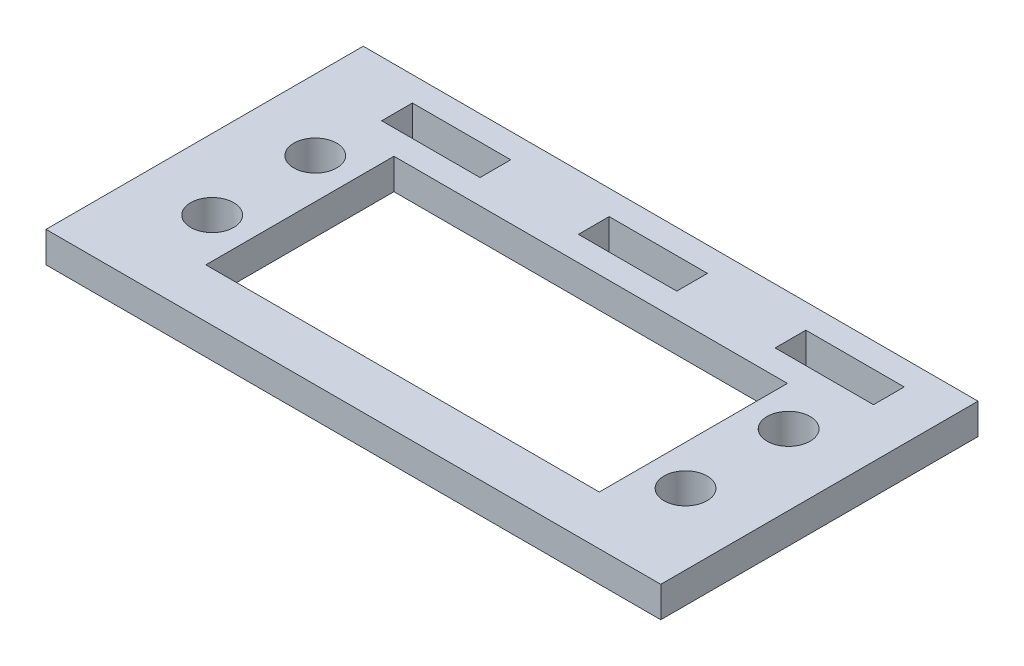
ISO-10303-21;
HEADER;
FILE_DESCRIPTION(('STEP AP214'),'2;1');
FILE_NAME('part.step','',(''),(''),'','','');
FILE_SCHEMA(('AUTOMOTIVE_DESIGN { 1 0 10303 214 1 1 1 1 }'));
ENDSEC;
DATA;
#1=APPLICATION_CONTEXT('core data for automotive mechanical design processes');
#2=APPLICATION_PROTOCOL_DEFINITION('international standard','automotive_design',2000,#1);
#3=PRODUCT_CONTEXT('',#1,'mechanical');
#4=PRODUCT('Part','Part','',(#3));
#5=PRODUCT_RELATED_PRODUCT_CATEGORY('part','',(#4));
#6=PRODUCT_DEFINITION_FORMATION('','',#4);
#7=PRODUCT_DEFINITION_CONTEXT('part definition',#1,'design');
#8=PRODUCT_DEFINITION('design','',#6,#7);
#9=PRODUCT_DEFINITION_SHAPE('','',#8);
#10=(LENGTH_UNIT() NAMED_UNIT(*) SI_UNIT(.MILLI.,.METRE.));
#11=(NAMED_UNIT(*) PLANE_ANGLE_UNIT() SI_UNIT($,.RADIAN.));
#12=(NAMED_UNIT(*) SI_UNIT($,.STERADIAN.) SOLID_ANGLE_UNIT());
#13=UNCERTAINTY_MEASURE_WITH_UNIT(LENGTH_MEASURE(1.E-05),#10,'distance_accuracy_value','');
#14=(GEOMETRIC_REPRESENTATION_CONTEXT(3) GLOBAL_UNCERTAINTY_ASSIGNED_CONTEXT((#13)) GLOBAL_UNIT_ASSIGNED_CONTEXT((#10,
#11,#12)) REPRESENTATION_CONTEXT('',''));
#15=CARTESIAN_POINT('',(0.,0.,0.));
#16=DIRECTION('',(0.,0.,1.));
#17=DIRECTION('',(1.,0.,0.));
#18=AXIS2_PLACEMENT_3D('',#15,#16,#17);
#19=CARTESIAN_POINT('',(31.75,3.175,14.7955));
#20=DIRECTION('',(0.,-1.,0.));
#21=DIRECTION('',(0.,0.,-1.));
#22=AXIS2_PLACEMENT_3D('',#19,#20,#21);
#23=PLANE('',#22);
#24=CARTESIAN_POINT('',(24.4475,3.175,-5.71191009209215));
#25=DIRECTION('',(0.,1.,0.));
#26=DIRECTION('',(0.,0.,1.));
#27=AXIS2_PLACEMENT_3D('',#24,#25,#26);
#28=CIRCLE('',#27,2.2225);
#29=CARTESIAN_POINT('',(24.4475,3.175,-3.48941009209216));
#30=VERTEX_POINT('',#29);
#31=EDGE_CURVE('E472',#30,#30,#28,.T.);
#32=ORIENTED_EDGE('',*,*,#31,.F.);
#33=EDGE_LOOP('',(#32));
#34=FACE_BOUND('',#33,.T.);
#35=CARTESIAN_POINT('',(-24.4475,3.175,-5.71191009209215));
#36=DIRECTION('',(0.,1.,0.));
#37=DIRECTION('',(0.,0.,1.));
#38=AXIS2_PLACEMENT_3D('',#35,#36,#37);
#39=CIRCLE('',#38,2.2225);
#40=CARTESIAN_POINT('',(-24.4475,3.175,-3.48941009209216));
#41=VERTEX_POINT('',#40);
#42=EDGE_CURVE('E200',#41,#41,#39,.T.);
#43=ORIENTED_EDGE('',*,*,#42,.F.);
#44=EDGE_LOOP('',(#43));
#45=FACE_BOUND('',#44,.T.);
#46=DIRECTION('',(0.,0.,1.));
#47=VECTOR('',#46,1.);
#48=CARTESIAN_POINT('',(-24.13,3.175,-15.4304999999997));
#49=LINE('',#48,#47);
#50=CARTESIAN_POINT('',(-24.13,3.175,-15.4304999999997));
#51=VERTEX_POINT('',#50);
#52=CARTESIAN_POINT('',(-24.13,3.175,-12.2554999999997));
#53=VERTEX_POINT('',#52);
#54=EDGE_CURVE('E210',#51,#53,#49,.T.);
#55=ORIENTED_EDGE('',*,*,#54,.F.);
#56=DIRECTION('',(-1.,0.,0.));
#57=VECTOR('',#56,1.);
#58=CARTESIAN_POINT('',(-13.97,3.175,-15.4304999999997));
#59=LINE('',#58,#57);
#60=CARTESIAN_POINT('',(-13.97,3.175,-15.4304999999997));
#61=VERTEX_POINT('',#60);
#62=EDGE_CURVE('E218',#61,#51,#59,.T.);
#63=ORIENTED_EDGE('',*,*,#62,.F.);
#64=DIRECTION('',(0.,0.,-1.));
#65=VECTOR('',#64,1.);
#66=CARTESIAN_POINT('',(-13.97,3.175,-15.4304999999997));
#67=LINE('',#66,#65);
#68=CARTESIAN_POINT('',(-13.97,3.175,-12.2554999999997));
#69=VERTEX_POINT('',#68);
#70=EDGE_CURVE('E215',#69,#61,#67,.T.);
#71=ORIENTED_EDGE('',*,*,#70,.F.);
#72=DIRECTION('',(1.,0.,0.));
#73=VECTOR('',#72,1.);
#74=CARTESIAN_POINT('',(-13.97,3.175,-12.2554999999997));
#75=LINE('',#74,#73);
#76=EDGE_CURVE('E212',#53,#69,#75,.T.);
#77=ORIENTED_EDGE('',*,*,#76,.F.);
#78=EDGE_LOOP('',(#55,#63,#71,#77));
#79=FACE_BOUND('',#78,.T.);
#80=DIRECTION('',(0.,0.,1.));
#81=VECTOR('',#80,1.);
#82=CARTESIAN_POINT('',(16.51,3.175,-15.4305));
#83=LINE('',#82,#81);
#84=CARTESIAN_POINT('',(16.51,3.175,-15.4305));
#85=VERTEX_POINT('',#84);
#86=CARTESIAN_POINT('',(16.51,3.175,-12.2555));
#87=VERTEX_POINT('',#86);
#88=EDGE_CURVE('E272',#85,#87,#83,.T.);
#89=ORIENTED_EDGE('',*,*,#88,.F.);
#90=DIRECTION('',(-1.,0.,0.));
#91=VECTOR('',#90,1.);
#92=CARTESIAN_POINT('',(26.67,3.175,-15.4305));
#93=LINE('',#92,#91);
#94=CARTESIAN_POINT('',(26.67,3.175,-15.4305));
#95=VERTEX_POINT('',#94);
#96=EDGE_CURVE('E280',#95,#85,#93,.T.);
#97=ORIENTED_EDGE('',*,*,#96,.F.);
#98=DIRECTION('',(0.,0.,-1.));
#99=VECTOR('',#98,1.);
#100=CARTESIAN_POINT('',(26.67,3.175,-15.4305));
#101=LINE('',#100,#99);
#102=CARTESIAN_POINT('',(26.67,3.175,-12.2555));
#103=VERTEX_POINT('',#102);
#104=EDGE_CURVE('E277',#103,#95,#101,.T.);
#105=ORIENTED_EDGE('',*,*,#104,.F.);
#106=DIRECTION('',(1.,0.,0.));
#107=VECTOR('',#106,1.);
#108=CARTESIAN_POINT('',(26.67,3.175,-12.2555));
#109=LINE('',#108,#107);
#110=EDGE_CURVE('E274',#87,#103,#109,.T.);
#111=ORIENTED_EDGE('',*,*,#110,.F.);
#112=EDGE_LOOP('',(#89,#97,#105,#111));
#113=FACE_BOUND('',#112,.T.);
#114=DIRECTION('',(0.,0.,-1.));
#115=VECTOR('',#114,1.);
#116=CARTESIAN_POINT('',(31.75,3.175,-17.9705));
#117=LINE('',#116,#115);
#118=CARTESIAN_POINT('',(31.75,3.175,14.7955));
#119=VERTEX_POINT('',#118);
#120=CARTESIAN_POINT('',(31.75,3.175,-17.9705));
#121=VERTEX_POINT('',#120);
#122=EDGE_CURVE('E303',#119,#121,#117,.T.);
#123=ORIENTED_EDGE('',*,*,#122,.T.);
#124=DIRECTION('',(-1.,0.,0.));
#125=VECTOR('',#124,1.);
#126=CARTESIAN_POINT('',(31.75,3.175,-17.9705));
#127=LINE('',#126,#125);
#128=CARTESIAN_POINT('',(-31.75,3.175,-17.9705));
#129=VERTEX_POINT('',#128);
#130=EDGE_CURVE('E306',#121,#129,#127,.T.);
#131=ORIENTED_EDGE('',*,*,#130,.T.);
#132=DIRECTION('',(0.,0.,1.));
#133=VECTOR('',#132,1.);
#134=CARTESIAN_POINT('',(-31.75,3.175,-17.9705));
#135=LINE('',#134,#133);
#136=CARTESIAN_POINT('',(-31.75,3.175,14.7955));
#137=VERTEX_POINT('',#136);
#138=EDGE_CURVE('E309',#129,#137,#135,.T.);
#139=ORIENTED_EDGE('',*,*,#138,.T.);
#140=DIRECTION('',(1.,0.,0.));
#141=VECTOR('',#140,1.);
#142=CARTESIAN_POINT('',(31.75,3.175,14.7955));
#143=LINE('',#142,#141);
#144=EDGE_CURVE('E311',#137,#119,#143,.T.);
#145=ORIENTED_EDGE('',*,*,#144,.T.);
#146=EDGE_LOOP('',(#123,#131,#139,#145));
#147=FACE_BOUND('',#146,.T.);
#148=DIRECTION('',(0.,0.,1.));
#149=VECTOR('',#148,1.);
#150=CARTESIAN_POINT('',(-3.81000000000001,3.175,-15.4304999999999));
#151=LINE('',#150,#149);
#152=CARTESIAN_POINT('',(-3.81000000000001,3.175,-15.4304999999999));
#153=VERTEX_POINT('',#152);
#154=CARTESIAN_POINT('',(-3.81000000000001,3.175,-12.2554999999999));
#155=VERTEX_POINT('',#154);
#156=EDGE_CURVE('E241',#153,#155,#151,.T.);
#157=ORIENTED_EDGE('',*,*,#156,.F.);
#158=DIRECTION('',(-1.,0.,0.));
#159=VECTOR('',#158,1.);
#160=CARTESIAN_POINT('',(6.34999999999999,3.175,-15.4304999999999));
#161=LINE('',#160,#159);
#162=CARTESIAN_POINT('',(6.34999999999999,3.175,-15.4304999999999));
#163=VERTEX_POINT('',#162);
#164=EDGE_CURVE('E249',#163,#153,#161,.T.);
#165=ORIENTED_EDGE('',*,*,#164,.F.);
#166=DIRECTION('',(0.,0.,-1.));
#167=VECTOR('',#166,1.);
#168=CARTESIAN_POINT('',(6.34999999999999,3.175,-15.4304999999999));
#169=LINE('',#168,#167);
#170=CARTESIAN_POINT('',(6.34999999999999,3.175,-12.2554999999999));
#171=VERTEX_POINT('',#170);
#172=EDGE_CURVE('E246',#171,#163,#169,.T.);
#173=ORIENTED_EDGE('',*,*,#172,.F.);
#174=DIRECTION('',(1.,0.,0.));
#175=VECTOR('',#174,1.);
#176=CARTESIAN_POINT('',(6.34999999999999,3.175,-12.2554999999999));
#177=LINE('',#176,#175);
#178=EDGE_CURVE('E243',#155,#171,#177,.T.);
#179=ORIENTED_EDGE('',*,*,#178,.F.);
#180=EDGE_LOOP('',(#157,#165,#173,#179));
#181=FACE_BOUND('',#180,.T.);
#182=DIRECTION('',(0.,0.,-1.));
#183=VECTOR('',#182,1.);
#184=CARTESIAN_POINT('',(20.32,3.175,9.7155));
#185=LINE('',#184,#183);
#186=CARTESIAN_POINT('',(20.32,3.175,9.7155));
#187=VERTEX_POINT('',#186);
#188=CARTESIAN_POINT('',(20.32,3.175,-9.7155));
#189=VERTEX_POINT('',#188);
#190=EDGE_CURVE('E171',#187,#189,#185,.T.);
#191=ORIENTED_EDGE('',*,*,#190,.F.);
#192=DIRECTION('',(1.,0.,0.));
#193=VECTOR('',#192,1.);
#194=CARTESIAN_POINT('',(-20.32,3.175,9.7155));
#195=LINE('',#194,#193);
#196=CARTESIAN_POINT('',(-20.32,3.175,9.7155));
#197=VERTEX_POINT('',#196);
#198=EDGE_CURVE('E194',#197,#187,#195,.T.);
#199=ORIENTED_EDGE('',*,*,#198,.F.);
#200=DIRECTION('',(0.,0.,1.));
#201=VECTOR('',#200,1.);
#202=CARTESIAN_POINT('',(-20.32,3.175,9.7155));
#203=LINE('',#202,#201);
#204=CARTESIAN_POINT('',(-20.32,3.175,-9.7155));
#205=VERTEX_POINT('',#204);
#206=EDGE_CURVE('E192',#205,#197,#203,.T.);
#207=ORIENTED_EDGE('',*,*,#206,.F.);
#208=DIRECTION('',(-1.,0.,0.));
#209=VECTOR('',#208,1.);
#210=CARTESIAN_POINT('',(-20.32,3.175,-9.7155));
#211=LINE('',#210,#209);
#212=EDGE_CURVE('E179',#189,#205,#211,.T.);
#213=ORIENTED_EDGE('',*,*,#212,.F.);
#214=EDGE_LOOP('',(#191,#199,#207,#213));
#215=FACE_BOUND('',#214,.T.);
#216=CARTESIAN_POINT('',(-24.4475,3.175,4.93498923036739));
#217=DIRECTION('',(0.,1.,0.));
#218=DIRECTION('',(0.,0.,1.));
#219=AXIS2_PLACEMENT_3D('',#216,#217,#218);
#220=CIRCLE('',#219,2.2225);
#221=CARTESIAN_POINT('',(-24.4475,3.175,7.15748923036739));
#222=VERTEX_POINT('',#221);
#223=EDGE_CURVE('E478',#222,#222,#220,.T.);
#224=ORIENTED_EDGE('',*,*,#223,.F.);
#225=EDGE_LOOP('',(#224));
#226=FACE_BOUND('',#225,.T.);
#227=CARTESIAN_POINT('',(24.4475,3.175,4.93498923036739));
#228=DIRECTION('',(0.,1.,0.));
#229=DIRECTION('',(0.,0.,1.));
#230=AXIS2_PLACEMENT_3D('',#227,#228,#229);
#231=CIRCLE('',#230,2.2225);
#232=CARTESIAN_POINT('',(24.4475,3.175,7.15748923036739));
#233=VERTEX_POINT('',#232);
#234=EDGE_CURVE('E463',#233,#233,#231,.T.);
#235=ORIENTED_EDGE('',*,*,#234,.F.);
#236=EDGE_LOOP('',(#235));
#237=FACE_BOUND('',#236,.T.);
#238=ADVANCED_FACE('F34',(#34,#45,#79,#113,#147,#181,#215,#226,#237),#23,.F.);
#239=CARTESIAN_POINT('',(31.75,0.,14.7955));
#240=DIRECTION('',(0.,-1.,0.));
#241=DIRECTION('',(0.,0.,-1.));
#242=AXIS2_PLACEMENT_3D('',#239,#240,#241);
#243=PLANE('',#242);
#244=CARTESIAN_POINT('',(24.4475,0.,-5.71191009209215));
#245=DIRECTION('',(0.,1.,0.));
#246=DIRECTION('',(0.,0.,1.));
#247=AXIS2_PLACEMENT_3D('',#244,#245,#246);
#248=CIRCLE('',#247,2.2225);
#249=CARTESIAN_POINT('',(24.4475,0.,-3.48941009209216));
#250=VERTEX_POINT('',#249);
#251=EDGE_CURVE('E469',#250,#250,#248,.T.);
#252=ORIENTED_EDGE('',*,*,#251,.T.);
#253=EDGE_LOOP('',(#252));
#254=FACE_BOUND('',#253,.T.);
#255=CARTESIAN_POINT('',(-24.4475,0.,-5.71191009209215));
#256=DIRECTION('',(0.,1.,0.));
#257=DIRECTION('',(0.,0.,1.));
#258=AXIS2_PLACEMENT_3D('',#255,#256,#257);
#259=CIRCLE('',#258,2.2225);
#260=CARTESIAN_POINT('',(-24.4475,0.,-3.48941009209216));
#261=VERTEX_POINT('',#260);
#262=EDGE_CURVE('E481',#261,#261,#259,.T.);
#263=ORIENTED_EDGE('',*,*,#262,.T.);
#264=EDGE_LOOP('',(#263));
#265=FACE_BOUND('',#264,.T.);
#266=DIRECTION('',(-1.,0.,0.));
#267=VECTOR('',#266,1.);
#268=CARTESIAN_POINT('',(-13.97,0.,-15.4304999999997));
#269=LINE('',#268,#267);
#270=CARTESIAN_POINT('',(-13.97,0.,-15.4304999999997));
#271=VERTEX_POINT('',#270);
#272=CARTESIAN_POINT('',(-24.13,0.,-15.4304999999997));
#273=VERTEX_POINT('',#272);
#274=EDGE_CURVE('E213',#271,#273,#269,.T.);
#275=ORIENTED_EDGE('',*,*,#274,.T.);
#276=DIRECTION('',(0.,0.,1.));
#277=VECTOR('',#276,1.);
#278=CARTESIAN_POINT('',(-24.13,0.,-15.4304999999997));
#279=LINE('',#278,#277);
#280=CARTESIAN_POINT('',(-24.13,0.,-12.2554999999997));
#281=VERTEX_POINT('',#280);
#282=EDGE_CURVE('E187',#273,#281,#279,.T.);
#283=ORIENTED_EDGE('',*,*,#282,.T.);
#284=DIRECTION('',(1.,0.,0.));
#285=VECTOR('',#284,1.);
#286=CARTESIAN_POINT('',(-13.97,0.,-12.2554999999997));
#287=LINE('',#286,#285);
#288=CARTESIAN_POINT('',(-13.97,0.,-12.2554999999997));
#289=VERTEX_POINT('',#288);
#290=EDGE_CURVE('E223',#281,#289,#287,.T.);
#291=ORIENTED_EDGE('',*,*,#290,.T.);
#292=DIRECTION('',(0.,0.,-1.));
#293=VECTOR('',#292,1.);
#294=CARTESIAN_POINT('',(-13.97,0.,-15.4304999999997));
#295=LINE('',#294,#293);
#296=EDGE_CURVE('E226',#289,#271,#295,.T.);
#297=ORIENTED_EDGE('',*,*,#296,.T.);
#298=EDGE_LOOP('',(#275,#283,#291,#297));
#299=FACE_BOUND('',#298,.T.);
#300=DIRECTION('',(-1.,0.,0.));
#301=VECTOR('',#300,1.);
#302=CARTESIAN_POINT('',(26.67,0.,-15.4305));
#303=LINE('',#302,#301);
#304=CARTESIAN_POINT('',(26.67,0.,-15.4305));
#305=VERTEX_POINT('',#304);
#306=CARTESIAN_POINT('',(16.51,0.,-15.4305));
#307=VERTEX_POINT('',#306);
#308=EDGE_CURVE('E275',#305,#307,#303,.T.);
#309=ORIENTED_EDGE('',*,*,#308,.T.);
#310=DIRECTION('',(0.,0.,1.));
#311=VECTOR('',#310,1.);
#312=CARTESIAN_POINT('',(16.51,0.,-15.4305));
#313=LINE('',#312,#311);
#314=CARTESIAN_POINT('',(16.51,0.,-12.2555));
#315=VERTEX_POINT('',#314);
#316=EDGE_CURVE('E271',#307,#315,#313,.T.);
#317=ORIENTED_EDGE('',*,*,#316,.T.);
#318=DIRECTION('',(1.,0.,0.));
#319=VECTOR('',#318,1.);
#320=CARTESIAN_POINT('',(26.67,0.,-12.2555));
#321=LINE('',#320,#319);
#322=CARTESIAN_POINT('',(26.67,0.,-12.2555));
#323=VERTEX_POINT('',#322);
#324=EDGE_CURVE('E285',#315,#323,#321,.T.);
#325=ORIENTED_EDGE('',*,*,#324,.T.);
#326=DIRECTION('',(0.,0.,-1.));
#327=VECTOR('',#326,1.);
#328=CARTESIAN_POINT('',(26.67,0.,-15.4305));
#329=LINE('',#328,#327);
#330=EDGE_CURVE('E288',#323,#305,#329,.T.);
#331=ORIENTED_EDGE('',*,*,#330,.T.);
#332=EDGE_LOOP('',(#309,#317,#325,#331));
#333=FACE_BOUND('',#332,.T.);
#334=DIRECTION('',(0.,0.,-1.));
#335=VECTOR('',#334,1.);
#336=CARTESIAN_POINT('',(31.75,0.,-17.9705));
#337=LINE('',#336,#335);
#338=CARTESIAN_POINT('',(31.75,0.,14.7955));
#339=VERTEX_POINT('',#338);
#340=CARTESIAN_POINT('',(31.75,0.,-17.9705));
#341=VERTEX_POINT('',#340);
#342=EDGE_CURVE('E302',#339,#341,#337,.T.);
#343=ORIENTED_EDGE('',*,*,#342,.F.);
#344=DIRECTION('',(1.,0.,0.));
#345=VECTOR('',#344,1.);
#346=CARTESIAN_POINT('',(31.75,0.,14.7955));
#347=LINE('',#346,#345);
#348=CARTESIAN_POINT('',(-31.75,0.,14.7955));
#349=VERTEX_POINT('',#348);
#350=EDGE_CURVE('E307',#349,#339,#347,.T.);
#351=ORIENTED_EDGE('',*,*,#350,.F.);
#352=DIRECTION('',(0.,0.,1.));
#353=VECTOR('',#352,1.);
#354=CARTESIAN_POINT('',(-31.75,0.,-17.9705));
#355=LINE('',#354,#353);
#356=CARTESIAN_POINT('',(-31.75,0.,-17.9705));
#357=VERTEX_POINT('',#356);
#358=EDGE_CURVE('E318',#357,#349,#355,.T.);
#359=ORIENTED_EDGE('',*,*,#358,.F.);
#360=DIRECTION('',(-1.,0.,0.));
#361=VECTOR('',#360,1.);
#362=CARTESIAN_POINT('',(31.75,0.,-17.9705));
#363=LINE('',#362,#361);
#364=EDGE_CURVE('E316',#341,#357,#363,.T.);
#365=ORIENTED_EDGE('',*,*,#364,.F.);
#366=EDGE_LOOP('',(#343,#351,#359,#365));
#367=FACE_BOUND('',#366,.T.);
#368=DIRECTION('',(-1.,0.,0.));
#369=VECTOR('',#368,1.);
#370=CARTESIAN_POINT('',(6.34999999999999,0.,-15.4304999999999));
#371=LINE('',#370,#369);
#372=CARTESIAN_POINT('',(6.34999999999999,0.,-15.4304999999999));
#373=VERTEX_POINT('',#372);
#374=CARTESIAN_POINT('',(-3.81000000000001,0.,-15.4304999999999));
#375=VERTEX_POINT('',#374);
#376=EDGE_CURVE('E244',#373,#375,#371,.T.);
#377=ORIENTED_EDGE('',*,*,#376,.T.);
#378=DIRECTION('',(0.,0.,1.));
#379=VECTOR('',#378,1.);
#380=CARTESIAN_POINT('',(-3.81000000000001,0.,-15.4304999999999));
#381=LINE('',#380,#379);
#382=CARTESIAN_POINT('',(-3.81000000000001,0.,-12.2554999999999));
#383=VERTEX_POINT('',#382);
#384=EDGE_CURVE('E240',#375,#383,#381,.T.);
#385=ORIENTED_EDGE('',*,*,#384,.T.);
#386=DIRECTION('',(1.,0.,0.));
#387=VECTOR('',#386,1.);
#388=CARTESIAN_POINT('',(6.34999999999999,0.,-12.2554999999999));
#389=LINE('',#388,#387);
#390=CARTESIAN_POINT('',(6.34999999999999,0.,-12.2554999999999));
#391=VERTEX_POINT('',#390);
#392=EDGE_CURVE('E254',#383,#391,#389,.T.);
#393=ORIENTED_EDGE('',*,*,#392,.T.);
#394=DIRECTION('',(0.,0.,-1.));
#395=VECTOR('',#394,1.);
#396=CARTESIAN_POINT('',(6.34999999999999,0.,-15.4304999999999));
#397=LINE('',#396,#395);
#398=EDGE_CURVE('E257',#391,#373,#397,.T.);
#399=ORIENTED_EDGE('',*,*,#398,.T.);
#400=EDGE_LOOP('',(#377,#385,#393,#399));
#401=FACE_BOUND('',#400,.T.);
#402=DIRECTION('',(1.,0.,0.));
#403=VECTOR('',#402,1.);
#404=CARTESIAN_POINT('',(-20.32,0.,9.7155));
#405=LINE('',#404,#403);
#406=CARTESIAN_POINT('',(-20.32,0.,9.7155));
#407=VERTEX_POINT('',#406);
#408=CARTESIAN_POINT('',(20.32,0.,9.7155));
#409=VERTEX_POINT('',#408);
#410=EDGE_CURVE('E180',#407,#409,#405,.T.);
#411=ORIENTED_EDGE('',*,*,#410,.T.);
#412=DIRECTION('',(0.,0.,-1.));
#413=VECTOR('',#412,1.);
#414=CARTESIAN_POINT('',(20.32,0.,9.7155));
#415=LINE('',#414,#413);
#416=CARTESIAN_POINT('',(20.32,0.,-9.7155));
#417=VERTEX_POINT('',#416);
#418=EDGE_CURVE('E57',#409,#417,#415,.T.);
#419=ORIENTED_EDGE('',*,*,#418,.T.);
#420=DIRECTION('',(-1.,0.,0.));
#421=VECTOR('',#420,1.);
#422=CARTESIAN_POINT('',(-20.32,0.,-9.7155));
#423=LINE('',#422,#421);
#424=CARTESIAN_POINT('',(-20.32,0.,-9.7155));
#425=VERTEX_POINT('',#424);
#426=EDGE_CURVE('E186',#417,#425,#423,.T.);
#427=ORIENTED_EDGE('',*,*,#426,.T.);
#428=DIRECTION('',(0.,0.,1.));
#429=VECTOR('',#428,1.);
#430=CARTESIAN_POINT('',(-20.32,0.,9.7155));
#431=LINE('',#430,#429);
#432=EDGE_CURVE('E202',#425,#407,#431,.T.);
#433=ORIENTED_EDGE('',*,*,#432,.T.);
#434=EDGE_LOOP('',(#411,#419,#427,#433));
#435=FACE_BOUND('',#434,.T.);
#436=CARTESIAN_POINT('',(-24.4475,0.,4.93498923036739));
#437=DIRECTION('',(0.,1.,0.));
#438=DIRECTION('',(0.,0.,1.));
#439=AXIS2_PLACEMENT_3D('',#436,#437,#438);
#440=CIRCLE('',#439,2.2225);
#441=CARTESIAN_POINT('',(-24.4475,0.,7.15748923036739));
#442=VERTEX_POINT('',#441);
#443=EDGE_CURVE('E475',#442,#442,#440,.T.);
#444=ORIENTED_EDGE('',*,*,#443,.T.);
#445=EDGE_LOOP('',(#444));
#446=FACE_BOUND('',#445,.T.);
#447=CARTESIAN_POINT('',(24.4475,0.,4.93498923036739));
#448=DIRECTION('',(0.,1.,0.));
#449=DIRECTION('',(0.,0.,1.));
#450=AXIS2_PLACEMENT_3D('',#447,#448,#449);
#451=CIRCLE('',#450,2.2225);
#452=CARTESIAN_POINT('',(24.4475,0.,7.15748923036739));
#453=VERTEX_POINT('',#452);
#454=EDGE_CURVE('E466',#453,#453,#451,.T.);
#455=ORIENTED_EDGE('',*,*,#454,.T.);
#456=EDGE_LOOP('',(#455));
#457=FACE_BOUND('',#456,.T.);
#458=ADVANCED_FACE('F336',(#254,#265,#299,#333,#367,#401,#435,#446,#457),#243,.T.);
#459=CARTESIAN_POINT('',(31.75,3.175,-17.9705));
#460=DIRECTION('',(-1.,0.,0.));
#461=DIRECTION('',(0.,0.,1.));
#462=AXIS2_PLACEMENT_3D('',#459,#460,#461);
#463=PLANE('',#462);
#464=ORIENTED_EDGE('',*,*,#342,.T.);
#465=DIRECTION('',(0.,-1.,0.));
#466=VECTOR('',#465,1.);
#467=CARTESIAN_POINT('',(31.75,3.175,-17.9705));
#468=LINE('',#467,#466);
#469=EDGE_CURVE('E11',#121,#341,#468,.T.);
#470=ORIENTED_EDGE('',*,*,#469,.F.);
#471=ORIENTED_EDGE('',*,*,#122,.F.);
#472=DIRECTION('',(0.,-1.,0.));
#473=VECTOR('',#472,1.);
#474=CARTESIAN_POINT('',(31.75,3.175,14.7955));
#475=LINE('',#474,#473);
#476=EDGE_CURVE('E313',#119,#339,#475,.T.);
#477=ORIENTED_EDGE('',*,*,#476,.T.);
#478=EDGE_LOOP('',(#464,#470,#471,#477));
#479=FACE_BOUND('',#478,.T.);
#480=ADVANCED_FACE('F36',(#479),#463,.F.);
#481=CARTESIAN_POINT('',(31.75,3.175,-17.9705));
#482=DIRECTION('',(0.,0.,1.));
#483=DIRECTION('',(1.,0.,0.));
#484=AXIS2_PLACEMENT_3D('',#481,#482,#483);
#485=PLANE('',#484);
#486=ORIENTED_EDGE('',*,*,#364,.T.);
#487=DIRECTION('',(0.,-1.,0.));
#488=VECTOR('',#487,1.);
#489=CARTESIAN_POINT('',(-31.75,3.175,-17.9705));
#490=LINE('',#489,#488);
#491=EDGE_CURVE('E42',#129,#357,#490,.T.);
#492=ORIENTED_EDGE('',*,*,#491,.F.);
#493=ORIENTED_EDGE('',*,*,#130,.F.);
#494=ORIENTED_EDGE('',*,*,#469,.T.);
#495=EDGE_LOOP('',(#486,#492,#493,#494));
#496=FACE_BOUND('',#495,.T.);
#497=ADVANCED_FACE('F347',(#496),#485,.F.);
#498=CARTESIAN_POINT('',(-31.75,3.175,-17.9705));
#499=DIRECTION('',(1.,0.,0.));
#500=DIRECTION('',(0.,0.,-1.));
#501=AXIS2_PLACEMENT_3D('',#498,#499,#500);
#502=PLANE('',#501);
#503=ORIENTED_EDGE('',*,*,#358,.T.);
#504=DIRECTION('',(0.,-1.,0.));
#505=VECTOR('',#504,1.);
#506=CARTESIAN_POINT('',(-31.75,3.175,14.7955));
#507=LINE('',#506,#505);
#508=EDGE_CURVE('E323',#137,#349,#507,.T.);
#509=ORIENTED_EDGE('',*,*,#508,.F.);
#510=ORIENTED_EDGE('',*,*,#138,.F.);
#511=ORIENTED_EDGE('',*,*,#491,.T.);
#512=EDGE_LOOP('',(#503,#509,#510,#511));
#513=FACE_BOUND('',#512,.T.);
#514=ADVANCED_FACE('F330',(#513),#502,.F.);
#515=CARTESIAN_POINT('',(31.75,3.175,14.7955));
#516=DIRECTION('',(0.,0.,-1.));
#517=DIRECTION('',(-1.,0.,0.));
#518=AXIS2_PLACEMENT_3D('',#515,#516,#517);
#519=PLANE('',#518);
#520=ORIENTED_EDGE('',*,*,#350,.T.);
#521=ORIENTED_EDGE('',*,*,#476,.F.);
#522=ORIENTED_EDGE('',*,*,#144,.F.);
#523=ORIENTED_EDGE('',*,*,#508,.T.);
#524=EDGE_LOOP('',(#520,#521,#522,#523));
#525=FACE_BOUND('',#524,.T.);
#526=ADVANCED_FACE('F340',(#525),#519,.F.);
#527=CARTESIAN_POINT('',(16.51,3.175,-15.4305));
#528=DIRECTION('',(1.,0.,0.));
#529=DIRECTION('',(0.,0.,-1.));
#530=AXIS2_PLACEMENT_3D('',#527,#528,#529);
#531=PLANE('',#530);
#532=ORIENTED_EDGE('',*,*,#316,.F.);
#533=DIRECTION('',(0.,-1.,0.));
#534=VECTOR('',#533,1.);
#535=CARTESIAN_POINT('',(16.51,3.175,-15.4305));
#536=LINE('',#535,#534);
#537=EDGE_CURVE('E282',#85,#307,#536,.T.);
#538=ORIENTED_EDGE('',*,*,#537,.F.);
#539=ORIENTED_EDGE('',*,*,#88,.T.);
#540=DIRECTION('',(0.,-1.,0.));
#541=VECTOR('',#540,1.);
#542=CARTESIAN_POINT('',(16.51,3.175,-12.2555));
#543=LINE('',#542,#541);
#544=EDGE_CURVE('E299',#87,#315,#543,.T.);
#545=ORIENTED_EDGE('',*,*,#544,.T.);
#546=EDGE_LOOP('',(#532,#538,#539,#545));
#547=FACE_BOUND('',#546,.T.);
#548=ADVANCED_FACE('F365',(#547),#531,.T.);
#549=CARTESIAN_POINT('',(26.67,3.175,-12.2555));
#550=DIRECTION('',(0.,0.,-1.));
#551=DIRECTION('',(-1.,0.,0.));
#552=AXIS2_PLACEMENT_3D('',#549,#550,#551);
#553=PLANE('',#552);
#554=ORIENTED_EDGE('',*,*,#324,.F.);
#555=ORIENTED_EDGE('',*,*,#544,.F.);
#556=ORIENTED_EDGE('',*,*,#110,.T.);
#557=DIRECTION('',(0.,-1.,0.));
#558=VECTOR('',#557,1.);
#559=CARTESIAN_POINT('',(26.67,3.175,-12.2555));
#560=LINE('',#559,#558);
#561=EDGE_CURVE('E297',#103,#323,#560,.T.);
#562=ORIENTED_EDGE('',*,*,#561,.T.);
#563=EDGE_LOOP('',(#554,#555,#556,#562));
#564=FACE_BOUND('',#563,.T.);
#565=ADVANCED_FACE('F372',(#564),#553,.T.);
#566=CARTESIAN_POINT('',(26.67,3.175,-15.4305));
#567=DIRECTION('',(-1.,0.,0.));
#568=DIRECTION('',(0.,0.,1.));
#569=AXIS2_PLACEMENT_3D('',#566,#567,#568);
#570=PLANE('',#569);
#571=ORIENTED_EDGE('',*,*,#330,.F.);
#572=ORIENTED_EDGE('',*,*,#561,.F.);
#573=ORIENTED_EDGE('',*,*,#104,.T.);
#574=DIRECTION('',(0.,-1.,0.));
#575=VECTOR('',#574,1.);
#576=CARTESIAN_POINT('',(26.67,3.175,-15.4305));
#577=LINE('',#576,#575);
#578=EDGE_CURVE('E295',#95,#305,#577,.T.);
#579=ORIENTED_EDGE('',*,*,#578,.T.);
#580=EDGE_LOOP('',(#571,#572,#573,#579));
#581=FACE_BOUND('',#580,.T.);
#582=ADVANCED_FACE('F377',(#581),#570,.T.);
#583=CARTESIAN_POINT('',(26.67,3.175,-15.4305));
#584=DIRECTION('',(0.,0.,1.));
#585=DIRECTION('',(1.,0.,0.));
#586=AXIS2_PLACEMENT_3D('',#583,#584,#585);
#587=PLANE('',#586);
#588=ORIENTED_EDGE('',*,*,#308,.F.);
#589=ORIENTED_EDGE('',*,*,#578,.F.);
#590=ORIENTED_EDGE('',*,*,#96,.T.);
#591=ORIENTED_EDGE('',*,*,#537,.T.);
#592=EDGE_LOOP('',(#588,#589,#590,#591));
#593=FACE_BOUND('',#592,.T.);
#594=ADVANCED_FACE('F385',(#593),#587,.T.);
#595=CARTESIAN_POINT('',(-3.81000000000001,3.175,-15.4304999999999));
#596=DIRECTION('',(1.,0.,0.));
#597=DIRECTION('',(0.,0.,-1.));
#598=AXIS2_PLACEMENT_3D('',#595,#596,#597);
#599=PLANE('',#598);
#600=ORIENTED_EDGE('',*,*,#384,.F.);
#601=DIRECTION('',(0.,-1.,0.));
#602=VECTOR('',#601,1.);
#603=CARTESIAN_POINT('',(-3.81000000000001,3.175,-15.4304999999999));
#604=LINE('',#603,#602);
#605=EDGE_CURVE('E251',#153,#375,#604,.T.);
#606=ORIENTED_EDGE('',*,*,#605,.F.);
#607=ORIENTED_EDGE('',*,*,#156,.T.);
#608=DIRECTION('',(0.,-1.,0.));
#609=VECTOR('',#608,1.);
#610=CARTESIAN_POINT('',(-3.81000000000001,3.175,-12.2554999999999));
#611=LINE('',#610,#609);
#612=EDGE_CURVE('E268',#155,#383,#611,.T.);
#613=ORIENTED_EDGE('',*,*,#612,.T.);
#614=EDGE_LOOP('',(#600,#606,#607,#613));
#615=FACE_BOUND('',#614,.T.);
#616=ADVANCED_FACE('F398',(#615),#599,.T.);
#617=CARTESIAN_POINT('',(6.34999999999999,3.175,-12.2554999999999));
#618=DIRECTION('',(0.,0.,-1.));
#619=DIRECTION('',(-1.,0.,0.));
#620=AXIS2_PLACEMENT_3D('',#617,#618,#619);
#621=PLANE('',#620);
#622=ORIENTED_EDGE('',*,*,#392,.F.);
#623=ORIENTED_EDGE('',*,*,#612,.F.);
#624=ORIENTED_EDGE('',*,*,#178,.T.);
#625=DIRECTION('',(0.,-1.,0.));
#626=VECTOR('',#625,1.);
#627=CARTESIAN_POINT('',(6.34999999999999,3.175,-12.2554999999999));
#628=LINE('',#627,#626);
#629=EDGE_CURVE('E266',#171,#391,#628,.T.);
#630=ORIENTED_EDGE('',*,*,#629,.T.);
#631=EDGE_LOOP('',(#622,#623,#624,#630));
#632=FACE_BOUND('',#631,.T.);
#633=ADVANCED_FACE('F403',(#632),#621,.T.);
#634=CARTESIAN_POINT('',(6.34999999999999,3.175,-15.4304999999999));
#635=DIRECTION('',(-1.,0.,0.));
#636=DIRECTION('',(0.,0.,1.));
#637=AXIS2_PLACEMENT_3D('',#634,#635,#636);
#638=PLANE('',#637);
#639=ORIENTED_EDGE('',*,*,#398,.F.);
#640=ORIENTED_EDGE('',*,*,#629,.F.);
#641=ORIENTED_EDGE('',*,*,#172,.T.);
#642=DIRECTION('',(0.,-1.,0.));
#643=VECTOR('',#642,1.);
#644=CARTESIAN_POINT('',(6.34999999999999,3.175,-15.4304999999999));
#645=LINE('',#644,#643);
#646=EDGE_CURVE('E264',#163,#373,#645,.T.);
#647=ORIENTED_EDGE('',*,*,#646,.T.);
#648=EDGE_LOOP('',(#639,#640,#641,#647));
#649=FACE_BOUND('',#648,.T.);
#650=ADVANCED_FACE('F407',(#649),#638,.T.);
#651=CARTESIAN_POINT('',(6.34999999999999,3.175,-15.4304999999999));
#652=DIRECTION('',(0.,0.,1.));
#653=DIRECTION('',(1.,0.,0.));
#654=AXIS2_PLACEMENT_3D('',#651,#652,#653);
#655=PLANE('',#654);
#656=ORIENTED_EDGE('',*,*,#376,.F.);
#657=ORIENTED_EDGE('',*,*,#646,.F.);
#658=ORIENTED_EDGE('',*,*,#164,.T.);
#659=ORIENTED_EDGE('',*,*,#605,.T.);
#660=EDGE_LOOP('',(#656,#657,#658,#659));
#661=FACE_BOUND('',#660,.T.);
#662=ADVANCED_FACE('F411',(#661),#655,.T.);
#663=CARTESIAN_POINT('',(-24.13,3.175,-15.4304999999997));
#664=DIRECTION('',(1.,0.,0.));
#665=DIRECTION('',(0.,0.,-1.));
#666=AXIS2_PLACEMENT_3D('',#663,#664,#665);
#667=PLANE('',#666);
#668=ORIENTED_EDGE('',*,*,#282,.F.);
#669=DIRECTION('',(0.,-1.,0.));
#670=VECTOR('',#669,1.);
#671=CARTESIAN_POINT('',(-24.13,3.175,-15.4304999999997));
#672=LINE('',#671,#670);
#673=EDGE_CURVE('E220',#51,#273,#672,.T.);
#674=ORIENTED_EDGE('',*,*,#673,.F.);
#675=ORIENTED_EDGE('',*,*,#54,.T.);
#676=DIRECTION('',(0.,-1.,0.));
#677=VECTOR('',#676,1.);
#678=CARTESIAN_POINT('',(-24.13,3.175,-12.2554999999997));
#679=LINE('',#678,#677);
#680=EDGE_CURVE('E237',#53,#281,#679,.T.);
#681=ORIENTED_EDGE('',*,*,#680,.T.);
#682=EDGE_LOOP('',(#668,#674,#675,#681));
#683=FACE_BOUND('',#682,.T.);
#684=ADVANCED_FACE('F415',(#683),#667,.T.);
#685=CARTESIAN_POINT('',(-13.97,3.175,-12.2554999999997));
#686=DIRECTION('',(0.,0.,-1.));
#687=DIRECTION('',(-1.,0.,0.));
#688=AXIS2_PLACEMENT_3D('',#685,#686,#687);
#689=PLANE('',#688);
#690=ORIENTED_EDGE('',*,*,#290,.F.);
#691=ORIENTED_EDGE('',*,*,#680,.F.);
#692=ORIENTED_EDGE('',*,*,#76,.T.);
#693=DIRECTION('',(0.,-1.,0.));
#694=VECTOR('',#693,1.);
#695=CARTESIAN_POINT('',(-13.97,3.175,-12.2554999999997));
#696=LINE('',#695,#694);
#697=EDGE_CURVE('E235',#69,#289,#696,.T.);
#698=ORIENTED_EDGE('',*,*,#697,.T.);
#699=EDGE_LOOP('',(#690,#691,#692,#698));
#700=FACE_BOUND('',#699,.T.);
#701=ADVANCED_FACE('F419',(#700),#689,.T.);
#702=CARTESIAN_POINT('',(-13.97,3.175,-15.4304999999997));
#703=DIRECTION('',(-1.,0.,0.));
#704=DIRECTION('',(0.,0.,1.));
#705=AXIS2_PLACEMENT_3D('',#702,#703,#704);
#706=PLANE('',#705);
#707=ORIENTED_EDGE('',*,*,#296,.F.);
#708=ORIENTED_EDGE('',*,*,#697,.F.);
#709=ORIENTED_EDGE('',*,*,#70,.T.);
#710=DIRECTION('',(0.,-1.,0.));
#711=VECTOR('',#710,1.);
#712=CARTESIAN_POINT('',(-13.97,3.175,-15.4304999999997));
#713=LINE('',#712,#711);
#714=EDGE_CURVE('E233',#61,#271,#713,.T.);
#715=ORIENTED_EDGE('',*,*,#714,.T.);
#716=EDGE_LOOP('',(#707,#708,#709,#715));
#717=FACE_BOUND('',#716,.T.);
#718=ADVANCED_FACE('F423',(#717),#706,.T.);
#719=CARTESIAN_POINT('',(-13.97,3.175,-15.4304999999997));
#720=DIRECTION('',(0.,0.,1.));
#721=DIRECTION('',(1.,0.,0.));
#722=AXIS2_PLACEMENT_3D('',#719,#720,#721);
#723=PLANE('',#722);
#724=ORIENTED_EDGE('',*,*,#274,.F.);
#725=ORIENTED_EDGE('',*,*,#714,.F.);
#726=ORIENTED_EDGE('',*,*,#62,.T.);
#727=ORIENTED_EDGE('',*,*,#673,.T.);
#728=EDGE_LOOP('',(#724,#725,#726,#727));
#729=FACE_BOUND('',#728,.T.);
#730=ADVANCED_FACE('F427',(#729),#723,.T.);
#731=CARTESIAN_POINT('',(20.32,3.175,9.7155));
#732=DIRECTION('',(-1.,0.,0.));
#733=DIRECTION('',(0.,0.,1.));
#734=AXIS2_PLACEMENT_3D('',#731,#732,#733);
#735=PLANE('',#734);
#736=ORIENTED_EDGE('',*,*,#418,.F.);
#737=DIRECTION('',(0.,-1.,0.));
#738=VECTOR('',#737,1.);
#739=CARTESIAN_POINT('',(20.32,3.175,9.7155));
#740=LINE('',#739,#738);
#741=EDGE_CURVE('E175',#187,#409,#740,.T.);
#742=ORIENTED_EDGE('',*,*,#741,.F.);
#743=ORIENTED_EDGE('',*,*,#190,.T.);
#744=DIRECTION('',(0.,-1.,0.));
#745=VECTOR('',#744,1.);
#746=CARTESIAN_POINT('',(20.32,3.175,-9.7155));
#747=LINE('',#746,#745);
#748=EDGE_CURVE('E174',#189,#417,#747,.T.);
#749=ORIENTED_EDGE('',*,*,#748,.T.);
#750=EDGE_LOOP('',(#736,#742,#743,#749));
#751=FACE_BOUND('',#750,.T.);
#752=ADVANCED_FACE('F173',(#751),#735,.T.);
#753=CARTESIAN_POINT('',(-20.32,3.175,-9.7155));
#754=DIRECTION('',(0.,0.,1.));
#755=DIRECTION('',(1.,0.,0.));
#756=AXIS2_PLACEMENT_3D('',#753,#754,#755);
#757=PLANE('',#756);
#758=ORIENTED_EDGE('',*,*,#426,.F.);
#759=ORIENTED_EDGE('',*,*,#748,.F.);
#760=ORIENTED_EDGE('',*,*,#212,.T.);
#761=DIRECTION('',(0.,-1.,0.));
#762=VECTOR('',#761,1.);
#763=CARTESIAN_POINT('',(-20.32,3.175,-9.7155));
#764=LINE('',#763,#762);
#765=EDGE_CURVE('E188',#205,#425,#764,.T.);
#766=ORIENTED_EDGE('',*,*,#765,.T.);
#767=EDGE_LOOP('',(#758,#759,#760,#766));
#768=FACE_BOUND('',#767,.T.);
#769=ADVANCED_FACE('F183',(#768),#757,.T.);
#770=CARTESIAN_POINT('',(-20.32,3.175,9.7155));
#771=DIRECTION('',(1.,0.,0.));
#772=DIRECTION('',(0.,0.,-1.));
#773=AXIS2_PLACEMENT_3D('',#770,#771,#772);
#774=PLANE('',#773);
#775=ORIENTED_EDGE('',*,*,#432,.F.);
#776=ORIENTED_EDGE('',*,*,#765,.F.);
#777=ORIENTED_EDGE('',*,*,#206,.T.);
#778=DIRECTION('',(0.,-1.,0.));
#779=VECTOR('',#778,1.);
#780=CARTESIAN_POINT('',(-20.32,3.175,9.7155));
#781=LINE('',#780,#779);
#782=EDGE_CURVE('E49',#197,#407,#781,.T.);
#783=ORIENTED_EDGE('',*,*,#782,.T.);
#784=EDGE_LOOP('',(#775,#776,#777,#783));
#785=FACE_BOUND('',#784,.T.);
#786=ADVANCED_FACE('F436',(#785),#774,.T.);
#787=CARTESIAN_POINT('',(-20.32,3.175,9.7155));
#788=DIRECTION('',(0.,0.,-1.));
#789=DIRECTION('',(-1.,0.,0.));
#790=AXIS2_PLACEMENT_3D('',#787,#788,#789);
#791=PLANE('',#790);
#792=ORIENTED_EDGE('',*,*,#410,.F.);
#793=ORIENTED_EDGE('',*,*,#782,.F.);
#794=ORIENTED_EDGE('',*,*,#198,.T.);
#795=ORIENTED_EDGE('',*,*,#741,.T.);
#796=EDGE_LOOP('',(#792,#793,#794,#795));
#797=FACE_BOUND('',#796,.T.);
#798=ADVANCED_FACE('F439',(#797),#791,.T.);
#799=CARTESIAN_POINT('',(-24.4475,3.175,-5.71191009209215));
#800=DIRECTION('',(0.,-1.,0.));
#801=DIRECTION('',(0.,0.,-1.));
#802=AXIS2_PLACEMENT_3D('',#799,#800,#801);
#803=CYLINDRICAL_SURFACE('',#802,2.2225);
#804=ORIENTED_EDGE('',*,*,#42,.T.);
#805=EDGE_LOOP('',(#804));
#806=FACE_BOUND('',#805,.T.);
#807=ORIENTED_EDGE('',*,*,#262,.F.);
#808=EDGE_LOOP('',(#807));
#809=FACE_BOUND('',#808,.T.);
#810=ADVANCED_FACE('F443',(#806,#809),#803,.F.);
#811=CARTESIAN_POINT('',(-24.4475,3.175,4.93498923036739));
#812=DIRECTION('',(0.,-1.,0.));
#813=DIRECTION('',(0.,0.,-1.));
#814=AXIS2_PLACEMENT_3D('',#811,#812,#813);
#815=CYLINDRICAL_SURFACE('',#814,2.2225);
#816=ORIENTED_EDGE('',*,*,#223,.T.);
#817=EDGE_LOOP('',(#816));
#818=FACE_BOUND('',#817,.T.);
#819=ORIENTED_EDGE('',*,*,#443,.F.);
#820=EDGE_LOOP('',(#819));
#821=FACE_BOUND('',#820,.T.);
#822=ADVANCED_FACE('F446',(#818,#821),#815,.F.);
#823=CARTESIAN_POINT('',(24.4475,3.175,-5.71191009209215));
#824=DIRECTION('',(0.,-1.,0.));
#825=DIRECTION('',(0.,0.,-1.));
#826=AXIS2_PLACEMENT_3D('',#823,#824,#825);
#827=CYLINDRICAL_SURFACE('',#826,2.2225);
#828=ORIENTED_EDGE('',*,*,#31,.T.);
#829=EDGE_LOOP('',(#828));
#830=FACE_BOUND('',#829,.T.);
#831=ORIENTED_EDGE('',*,*,#251,.F.);
#832=EDGE_LOOP('',(#831));
#833=FACE_BOUND('',#832,.T.);
#834=ADVANCED_FACE('F450',(#830,#833),#827,.F.);
#835=CARTESIAN_POINT('',(24.4475,3.175,4.93498923036739));
#836=DIRECTION('',(0.,-1.,0.));
#837=DIRECTION('',(0.,0.,-1.));
#838=AXIS2_PLACEMENT_3D('',#835,#836,#837);
#839=CYLINDRICAL_SURFACE('',#838,2.2225);
#840=ORIENTED_EDGE('',*,*,#234,.T.);
#841=EDGE_LOOP('',(#840));
#842=FACE_BOUND('',#841,.T.);
#843=ORIENTED_EDGE('',*,*,#454,.F.);
#844=EDGE_LOOP('',(#843));
#845=FACE_BOUND('',#844,.T.);
#846=ADVANCED_FACE('F454',(#842,#845),#839,.F.);
#847=CLOSED_SHELL('',(#238,#458,#480,#497,#514,#526,#548,#565,#582,#594,#616,#633,#650,#662,
#684,#701,#718,#730,#752,#769,#786,#798,#810,#822,#834,#846));
#848=MANIFOLD_SOLID_BREP('B2',#847);
#849=ADVANCED_BREP_SHAPE_REPRESENTATION('',(#18,#848),#14);
#850=SHAPE_DEFINITION_REPRESENTATION(#9,#849);
ENDSEC;
END-ISO-10303-21;
